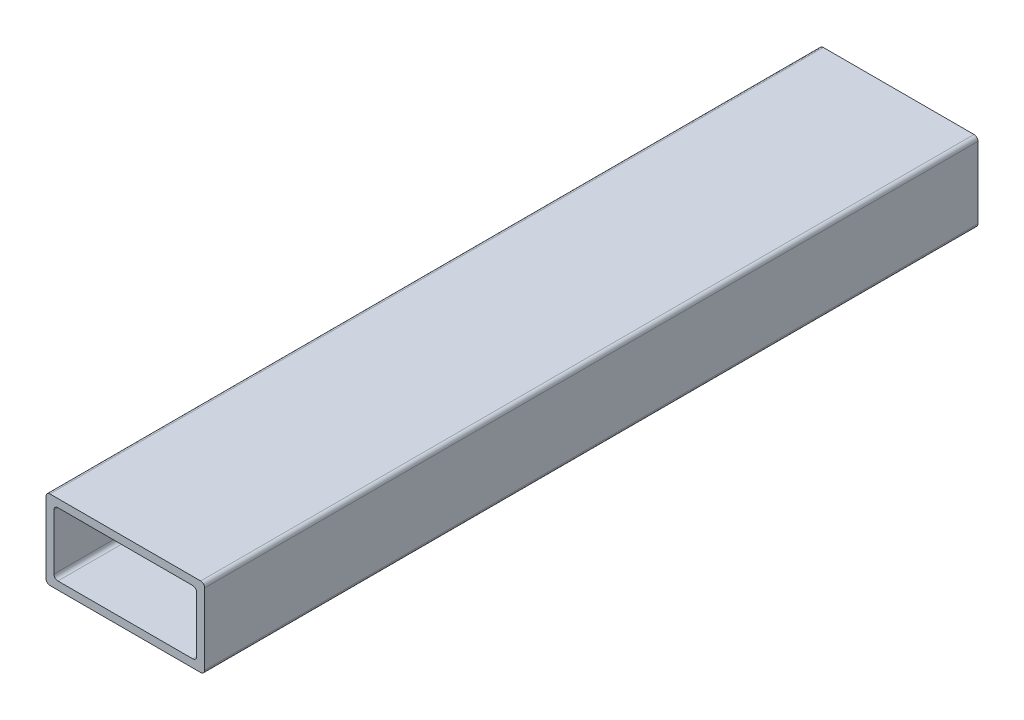
ISO-10303-21;
HEADER;
FILE_DESCRIPTION(('STEP AP214'),'2;1');
FILE_NAME('part.step','',(''),(''),'','','');
FILE_SCHEMA(('AUTOMOTIVE_DESIGN { 1 0 10303 214 1 1 1 1 }'));
ENDSEC;
DATA;
#1=APPLICATION_CONTEXT('core data for automotive mechanical design processes');
#2=APPLICATION_PROTOCOL_DEFINITION('international standard','automotive_design',2000,#1);
#3=PRODUCT_CONTEXT('',#1,'mechanical');
#4=PRODUCT('Part','Part','',(#3));
#5=PRODUCT_RELATED_PRODUCT_CATEGORY('part','',(#4));
#6=PRODUCT_DEFINITION_FORMATION('','',#4);
#7=PRODUCT_DEFINITION_CONTEXT('part definition',#1,'design');
#8=PRODUCT_DEFINITION('design','',#6,#7);
#9=PRODUCT_DEFINITION_SHAPE('','',#8);
#10=(LENGTH_UNIT() NAMED_UNIT(*) SI_UNIT(.MILLI.,.METRE.));
#11=(NAMED_UNIT(*) PLANE_ANGLE_UNIT() SI_UNIT($,.RADIAN.));
#12=(NAMED_UNIT(*) SI_UNIT($,.STERADIAN.) SOLID_ANGLE_UNIT());
#13=UNCERTAINTY_MEASURE_WITH_UNIT(LENGTH_MEASURE(1.E-05),#10,'distance_accuracy_value','');
#14=(GEOMETRIC_REPRESENTATION_CONTEXT(3) GLOBAL_UNCERTAINTY_ASSIGNED_CONTEXT((#13)) GLOBAL_UNIT_ASSIGNED_CONTEXT((#10,
#11,#12)) REPRESENTATION_CONTEXT('',''));
#15=CARTESIAN_POINT('',(0.,0.,0.));
#16=DIRECTION('',(0.,0.,1.));
#17=DIRECTION('',(1.,0.,0.));
#18=AXIS2_PLACEMENT_3D('',#15,#16,#17);
#19=CARTESIAN_POINT('',(2.,2.,390.));
#20=DIRECTION('',(0.,0.,-1.));
#21=DIRECTION('',(-1.,0.,0.));
#22=AXIS2_PLACEMENT_3D('',#19,#20,#21);
#23=PLANE('',#22);
#24=CARTESIAN_POINT('',(2.,2.,390.));
#25=DIRECTION('',(0.,0.,1.));
#26=DIRECTION('',(-1.,0.,0.));
#27=AXIS2_PLACEMENT_3D('',#24,#25,#26);
#28=CIRCLE('',#27,2.);
#29=CARTESIAN_POINT('',(0.,2.00000000000001,390.));
#30=VERTEX_POINT('',#29);
#31=CARTESIAN_POINT('',(2.00000000000001,0.,390.));
#32=VERTEX_POINT('',#31);
#33=EDGE_CURVE('E211',#30,#32,#28,.T.);
#34=ORIENTED_EDGE('',*,*,#33,.T.);
#35=DIRECTION('',(1.,0.,0.));
#36=VECTOR('',#35,1.);
#37=CARTESIAN_POINT('',(2.00000000000001,0.,390.));
#38=LINE('',#37,#36);
#39=CARTESIAN_POINT('',(78.,0.,390.));
#40=VERTEX_POINT('',#39);
#41=EDGE_CURVE('E214',#32,#40,#38,.T.);
#42=ORIENTED_EDGE('',*,*,#41,.T.);
#43=CARTESIAN_POINT('',(78.,2.,390.));
#44=DIRECTION('',(0.,0.,1.));
#45=DIRECTION('',(-1.,0.,0.));
#46=AXIS2_PLACEMENT_3D('',#43,#44,#45);
#47=CIRCLE('',#46,2.);
#48=CARTESIAN_POINT('',(80.,2.,390.));
#49=VERTEX_POINT('',#48);
#50=EDGE_CURVE('E217',#40,#49,#47,.T.);
#51=ORIENTED_EDGE('',*,*,#50,.T.);
#52=DIRECTION('',(0.,1.,0.));
#53=VECTOR('',#52,1.);
#54=CARTESIAN_POINT('',(80.,2.,390.));
#55=LINE('',#54,#53);
#56=CARTESIAN_POINT('',(80.,38.,390.));
#57=VERTEX_POINT('',#56);
#58=EDGE_CURVE('E219',#49,#57,#55,.T.);
#59=ORIENTED_EDGE('',*,*,#58,.T.);
#60=CARTESIAN_POINT('',(78.,38.,390.));
#61=DIRECTION('',(0.,0.,1.));
#62=DIRECTION('',(-1.,0.,0.));
#63=AXIS2_PLACEMENT_3D('',#60,#61,#62);
#64=CIRCLE('',#63,2.);
#65=CARTESIAN_POINT('',(78.,40.,390.));
#66=VERTEX_POINT('',#65);
#67=EDGE_CURVE('E221',#57,#66,#64,.T.);
#68=ORIENTED_EDGE('',*,*,#67,.T.);
#69=DIRECTION('',(-1.,0.,0.));
#70=VECTOR('',#69,1.);
#71=CARTESIAN_POINT('',(2.00000000000001,40.,390.));
#72=LINE('',#71,#70);
#73=CARTESIAN_POINT('',(2.00000000000001,40.,390.));
#74=VERTEX_POINT('',#73);
#75=EDGE_CURVE('E223',#66,#74,#72,.T.);
#76=ORIENTED_EDGE('',*,*,#75,.T.);
#77=CARTESIAN_POINT('',(2.,38.,390.));
#78=DIRECTION('',(0.,0.,1.));
#79=DIRECTION('',(-1.,0.,0.));
#80=AXIS2_PLACEMENT_3D('',#77,#78,#79);
#81=CIRCLE('',#80,2.);
#82=CARTESIAN_POINT('',(0.,38.,390.));
#83=VERTEX_POINT('',#82);
#84=EDGE_CURVE('E225',#74,#83,#81,.T.);
#85=ORIENTED_EDGE('',*,*,#84,.T.);
#86=DIRECTION('',(0.,-1.,0.));
#87=VECTOR('',#86,1.);
#88=CARTESIAN_POINT('',(0.,2.00000000000001,390.));
#89=LINE('',#88,#87);
#90=EDGE_CURVE('E227',#83,#30,#89,.T.);
#91=ORIENTED_EDGE('',*,*,#90,.T.);
#92=EDGE_LOOP('',(#34,#42,#51,#59,#68,#76,#85,#91));
#93=FACE_BOUND('',#92,.T.);
#94=CARTESIAN_POINT('',(74.,6.,390.));
#95=DIRECTION('',(0.,0.,1.));
#96=DIRECTION('',(1.,0.,0.));
#97=AXIS2_PLACEMENT_3D('',#94,#95,#96);
#98=CIRCLE('',#97,2.);
#99=CARTESIAN_POINT('',(74.,4.,390.));
#100=VERTEX_POINT('',#99);
#101=CARTESIAN_POINT('',(76.,6.,390.));
#102=VERTEX_POINT('',#101);
#103=EDGE_CURVE('E146',#100,#102,#98,.T.);
#104=ORIENTED_EDGE('',*,*,#103,.F.);
#105=DIRECTION('',(1.,0.,0.));
#106=VECTOR('',#105,1.);
#107=CARTESIAN_POINT('',(6.00000000000001,4.,390.));
#108=LINE('',#107,#106);
#109=CARTESIAN_POINT('',(6.00000000000001,4.,390.));
#110=VERTEX_POINT('',#109);
#111=EDGE_CURVE('E179',#110,#100,#108,.T.);
#112=ORIENTED_EDGE('',*,*,#111,.F.);
#113=CARTESIAN_POINT('',(6.,6.,390.));
#114=DIRECTION('',(0.,0.,1.));
#115=DIRECTION('',(1.,0.,0.));
#116=AXIS2_PLACEMENT_3D('',#113,#114,#115);
#117=CIRCLE('',#116,2.);
#118=CARTESIAN_POINT('',(4.,6.00000000000001,390.));
#119=VERTEX_POINT('',#118);
#120=EDGE_CURVE('E177',#119,#110,#117,.T.);
#121=ORIENTED_EDGE('',*,*,#120,.F.);
#122=DIRECTION('',(0.,-1.,0.));
#123=VECTOR('',#122,1.);
#124=CARTESIAN_POINT('',(4.,6.00000000000001,390.));
#125=LINE('',#124,#123);
#126=CARTESIAN_POINT('',(4.,34.,390.));
#127=VERTEX_POINT('',#126);
#128=EDGE_CURVE('E175',#127,#119,#125,.T.);
#129=ORIENTED_EDGE('',*,*,#128,.F.);
#130=CARTESIAN_POINT('',(6.,34.,390.));
#131=DIRECTION('',(0.,0.,1.));
#132=DIRECTION('',(1.,0.,0.));
#133=AXIS2_PLACEMENT_3D('',#130,#131,#132);
#134=CIRCLE('',#133,2.);
#135=CARTESIAN_POINT('',(6.00000000000001,36.,390.));
#136=VERTEX_POINT('',#135);
#137=EDGE_CURVE('E173',#136,#127,#134,.T.);
#138=ORIENTED_EDGE('',*,*,#137,.F.);
#139=DIRECTION('',(-1.,0.,0.));
#140=VECTOR('',#139,1.);
#141=CARTESIAN_POINT('',(6.00000000000001,36.,390.));
#142=LINE('',#141,#140);
#143=CARTESIAN_POINT('',(74.,36.,390.));
#144=VERTEX_POINT('',#143);
#145=EDGE_CURVE('E169',#144,#136,#142,.T.);
#146=ORIENTED_EDGE('',*,*,#145,.F.);
#147=CARTESIAN_POINT('',(74.,34.,390.));
#148=DIRECTION('',(0.,0.,1.));
#149=DIRECTION('',(1.,0.,0.));
#150=AXIS2_PLACEMENT_3D('',#147,#148,#149);
#151=CIRCLE('',#150,2.);
#152=CARTESIAN_POINT('',(76.,34.,390.));
#153=VERTEX_POINT('',#152);
#154=EDGE_CURVE('E167',#153,#144,#151,.T.);
#155=ORIENTED_EDGE('',*,*,#154,.F.);
#156=DIRECTION('',(0.,1.,0.));
#157=VECTOR('',#156,1.);
#158=CARTESIAN_POINT('',(76.,6.,390.));
#159=LINE('',#158,#157);
#160=EDGE_CURVE('E154',#102,#153,#159,.T.);
#161=ORIENTED_EDGE('',*,*,#160,.F.);
#162=EDGE_LOOP('',(#104,#112,#121,#129,#138,#146,#155,#161));
#163=FACE_BOUND('',#162,.T.);
#164=ADVANCED_FACE('F33',(#93,#163),#23,.F.);
#165=CARTESIAN_POINT('',(2.,2.,0.));
#166=DIRECTION('',(0.,0.,-1.));
#167=DIRECTION('',(-1.,0.,0.));
#168=AXIS2_PLACEMENT_3D('',#165,#166,#167);
#169=PLANE('',#168);
#170=CARTESIAN_POINT('',(2.,2.,0.));
#171=DIRECTION('',(0.,0.,1.));
#172=DIRECTION('',(-1.,0.,0.));
#173=AXIS2_PLACEMENT_3D('',#170,#171,#172);
#174=CIRCLE('',#173,2.);
#175=CARTESIAN_POINT('',(0.,2.00000000000001,0.));
#176=VERTEX_POINT('',#175);
#177=CARTESIAN_POINT('',(2.00000000000001,0.,0.));
#178=VERTEX_POINT('',#177);
#179=EDGE_CURVE('E162',#176,#178,#174,.T.);
#180=ORIENTED_EDGE('',*,*,#179,.F.);
#181=DIRECTION('',(0.,-1.,0.));
#182=VECTOR('',#181,1.);
#183=CARTESIAN_POINT('',(0.,2.00000000000001,0.));
#184=LINE('',#183,#182);
#185=CARTESIAN_POINT('',(0.,38.,0.));
#186=VERTEX_POINT('',#185);
#187=EDGE_CURVE('E215',#186,#176,#184,.T.);
#188=ORIENTED_EDGE('',*,*,#187,.F.);
#189=CARTESIAN_POINT('',(2.,38.,0.));
#190=DIRECTION('',(0.,0.,1.));
#191=DIRECTION('',(-1.,0.,0.));
#192=AXIS2_PLACEMENT_3D('',#189,#190,#191);
#193=CIRCLE('',#192,2.);
#194=CARTESIAN_POINT('',(2.00000000000001,40.,0.));
#195=VERTEX_POINT('',#194);
#196=EDGE_CURVE('E242',#195,#186,#193,.T.);
#197=ORIENTED_EDGE('',*,*,#196,.F.);
#198=DIRECTION('',(-1.,0.,0.));
#199=VECTOR('',#198,1.);
#200=CARTESIAN_POINT('',(2.00000000000001,40.,0.));
#201=LINE('',#200,#199);
#202=CARTESIAN_POINT('',(78.,40.,0.));
#203=VERTEX_POINT('',#202);
#204=EDGE_CURVE('E240',#203,#195,#201,.T.);
#205=ORIENTED_EDGE('',*,*,#204,.F.);
#206=CARTESIAN_POINT('',(78.,38.,0.));
#207=DIRECTION('',(0.,0.,1.));
#208=DIRECTION('',(-1.,0.,0.));
#209=AXIS2_PLACEMENT_3D('',#206,#207,#208);
#210=CIRCLE('',#209,2.);
#211=CARTESIAN_POINT('',(80.,38.,0.));
#212=VERTEX_POINT('',#211);
#213=EDGE_CURVE('E238',#212,#203,#210,.T.);
#214=ORIENTED_EDGE('',*,*,#213,.F.);
#215=DIRECTION('',(0.,1.,0.));
#216=VECTOR('',#215,1.);
#217=CARTESIAN_POINT('',(80.,2.,0.));
#218=LINE('',#217,#216);
#219=CARTESIAN_POINT('',(80.,2.,0.));
#220=VERTEX_POINT('',#219);
#221=EDGE_CURVE('E236',#220,#212,#218,.T.);
#222=ORIENTED_EDGE('',*,*,#221,.F.);
#223=CARTESIAN_POINT('',(78.,2.,0.));
#224=DIRECTION('',(0.,0.,1.));
#225=DIRECTION('',(-1.,0.,0.));
#226=AXIS2_PLACEMENT_3D('',#223,#224,#225);
#227=CIRCLE('',#226,2.);
#228=CARTESIAN_POINT('',(78.,0.,0.));
#229=VERTEX_POINT('',#228);
#230=EDGE_CURVE('E234',#229,#220,#227,.T.);
#231=ORIENTED_EDGE('',*,*,#230,.F.);
#232=DIRECTION('',(1.,0.,0.));
#233=VECTOR('',#232,1.);
#234=CARTESIAN_POINT('',(2.00000000000001,0.,0.));
#235=LINE('',#234,#233);
#236=EDGE_CURVE('E232',#178,#229,#235,.T.);
#237=ORIENTED_EDGE('',*,*,#236,.F.);
#238=EDGE_LOOP('',(#180,#188,#197,#205,#214,#222,#231,#237));
#239=FACE_BOUND('',#238,.T.);
#240=DIRECTION('',(1.,0.,0.));
#241=VECTOR('',#240,1.);
#242=CARTESIAN_POINT('',(6.00000000000001,4.,0.));
#243=LINE('',#242,#241);
#244=CARTESIAN_POINT('',(6.00000000000001,4.,0.));
#245=VERTEX_POINT('',#244);
#246=CARTESIAN_POINT('',(74.,4.,0.));
#247=VERTEX_POINT('',#246);
#248=EDGE_CURVE('E155',#245,#247,#243,.T.);
#249=ORIENTED_EDGE('',*,*,#248,.T.);
#250=CARTESIAN_POINT('',(74.,6.,0.));
#251=DIRECTION('',(0.,0.,1.));
#252=DIRECTION('',(1.,0.,0.));
#253=AXIS2_PLACEMENT_3D('',#250,#251,#252);
#254=CIRCLE('',#253,2.);
#255=CARTESIAN_POINT('',(76.,6.,0.));
#256=VERTEX_POINT('',#255);
#257=EDGE_CURVE('E56',#247,#256,#254,.T.);
#258=ORIENTED_EDGE('',*,*,#257,.T.);
#259=DIRECTION('',(0.,1.,0.));
#260=VECTOR('',#259,1.);
#261=CARTESIAN_POINT('',(76.,6.,0.));
#262=LINE('',#261,#260);
#263=CARTESIAN_POINT('',(76.,34.,0.));
#264=VERTEX_POINT('',#263);
#265=EDGE_CURVE('E161',#256,#264,#262,.T.);
#266=ORIENTED_EDGE('',*,*,#265,.T.);
#267=CARTESIAN_POINT('',(74.,34.,0.));
#268=DIRECTION('',(0.,0.,1.));
#269=DIRECTION('',(1.,0.,0.));
#270=AXIS2_PLACEMENT_3D('',#267,#268,#269);
#271=CIRCLE('',#270,2.);
#272=CARTESIAN_POINT('',(74.,36.,0.));
#273=VERTEX_POINT('',#272);
#274=EDGE_CURVE('E183',#264,#273,#271,.T.);
#275=ORIENTED_EDGE('',*,*,#274,.T.);
#276=DIRECTION('',(-1.,0.,0.));
#277=VECTOR('',#276,1.);
#278=CARTESIAN_POINT('',(6.00000000000001,36.,0.));
#279=LINE('',#278,#277);
#280=CARTESIAN_POINT('',(6.00000000000001,36.,0.));
#281=VERTEX_POINT('',#280);
#282=EDGE_CURVE('E186',#273,#281,#279,.T.);
#283=ORIENTED_EDGE('',*,*,#282,.T.);
#284=CARTESIAN_POINT('',(6.,34.,0.));
#285=DIRECTION('',(0.,0.,1.));
#286=DIRECTION('',(1.,0.,0.));
#287=AXIS2_PLACEMENT_3D('',#284,#285,#286);
#288=CIRCLE('',#287,2.);
#289=CARTESIAN_POINT('',(4.,34.,0.));
#290=VERTEX_POINT('',#289);
#291=EDGE_CURVE('E189',#281,#290,#288,.T.);
#292=ORIENTED_EDGE('',*,*,#291,.T.);
#293=DIRECTION('',(0.,-1.,0.));
#294=VECTOR('',#293,1.);
#295=CARTESIAN_POINT('',(4.,6.00000000000001,0.));
#296=LINE('',#295,#294);
#297=CARTESIAN_POINT('',(4.,6.00000000000001,0.));
#298=VERTEX_POINT('',#297);
#299=EDGE_CURVE('E192',#290,#298,#296,.T.);
#300=ORIENTED_EDGE('',*,*,#299,.T.);
#301=CARTESIAN_POINT('',(6.,6.,0.));
#302=DIRECTION('',(0.,0.,1.));
#303=DIRECTION('',(1.,0.,0.));
#304=AXIS2_PLACEMENT_3D('',#301,#302,#303);
#305=CIRCLE('',#304,2.);
#306=EDGE_CURVE('E195',#298,#245,#305,.T.);
#307=ORIENTED_EDGE('',*,*,#306,.T.);
#308=EDGE_LOOP('',(#249,#258,#266,#275,#283,#292,#300,#307));
#309=FACE_BOUND('',#308,.T.);
#310=ADVANCED_FACE('F272',(#239,#309),#169,.T.);
#311=CARTESIAN_POINT('',(2.,2.,390.));
#312=DIRECTION('',(0.,0.,-1.));
#313=DIRECTION('',(-1.,0.,0.));
#314=AXIS2_PLACEMENT_3D('',#311,#312,#313);
#315=CYLINDRICAL_SURFACE('',#314,2.);
#316=ORIENTED_EDGE('',*,*,#179,.T.);
#317=DIRECTION('',(0.,0.,-1.));
#318=VECTOR('',#317,1.);
#319=CARTESIAN_POINT('',(2.00000000000001,0.,390.));
#320=LINE('',#319,#318);
#321=EDGE_CURVE('E11',#32,#178,#320,.T.);
#322=ORIENTED_EDGE('',*,*,#321,.F.);
#323=ORIENTED_EDGE('',*,*,#33,.F.);
#324=DIRECTION('',(0.,0.,-1.));
#325=VECTOR('',#324,1.);
#326=CARTESIAN_POINT('',(0.,2.00000000000001,390.));
#327=LINE('',#326,#325);
#328=EDGE_CURVE('E229',#30,#176,#327,.T.);
#329=ORIENTED_EDGE('',*,*,#328,.T.);
#330=EDGE_LOOP('',(#316,#322,#323,#329));
#331=FACE_BOUND('',#330,.T.);
#332=ADVANCED_FACE('F35',(#331),#315,.T.);
#333=CARTESIAN_POINT('',(2.00000000000001,0.,390.));
#334=DIRECTION('',(0.,1.,0.));
#335=DIRECTION('',(0.,0.,1.));
#336=AXIS2_PLACEMENT_3D('',#333,#334,#335);
#337=PLANE('',#336);
#338=ORIENTED_EDGE('',*,*,#236,.T.);
#339=DIRECTION('',(0.,0.,-1.));
#340=VECTOR('',#339,1.);
#341=CARTESIAN_POINT('',(78.,0.,390.));
#342=LINE('',#341,#340);
#343=EDGE_CURVE('E41',#40,#229,#342,.T.);
#344=ORIENTED_EDGE('',*,*,#343,.F.);
#345=ORIENTED_EDGE('',*,*,#41,.F.);
#346=ORIENTED_EDGE('',*,*,#321,.T.);
#347=EDGE_LOOP('',(#338,#344,#345,#346));
#348=FACE_BOUND('',#347,.T.);
#349=ADVANCED_FACE('F289',(#348),#337,.F.);
#350=CARTESIAN_POINT('',(78.,2.,390.));
#351=DIRECTION('',(0.,0.,-1.));
#352=DIRECTION('',(-1.,0.,0.));
#353=AXIS2_PLACEMENT_3D('',#350,#351,#352);
#354=CYLINDRICAL_SURFACE('',#353,2.);
#355=ORIENTED_EDGE('',*,*,#230,.T.);
#356=DIRECTION('',(0.,0.,-1.));
#357=VECTOR('',#356,1.);
#358=CARTESIAN_POINT('',(80.,2.,390.));
#359=LINE('',#358,#357);
#360=EDGE_CURVE('E259',#49,#220,#359,.T.);
#361=ORIENTED_EDGE('',*,*,#360,.F.);
#362=ORIENTED_EDGE('',*,*,#50,.F.);
#363=ORIENTED_EDGE('',*,*,#343,.T.);
#364=EDGE_LOOP('',(#355,#361,#362,#363));
#365=FACE_BOUND('',#364,.T.);
#366=ADVANCED_FACE('F266',(#365),#354,.T.);
#367=CARTESIAN_POINT('',(80.,2.,390.));
#368=DIRECTION('',(-1.,0.,0.));
#369=DIRECTION('',(0.,0.,1.));
#370=AXIS2_PLACEMENT_3D('',#367,#368,#369);
#371=PLANE('',#370);
#372=ORIENTED_EDGE('',*,*,#221,.T.);
#373=DIRECTION('',(0.,0.,-1.));
#374=VECTOR('',#373,1.);
#375=CARTESIAN_POINT('',(80.,38.,390.));
#376=LINE('',#375,#374);
#377=EDGE_CURVE('E256',#57,#212,#376,.T.);
#378=ORIENTED_EDGE('',*,*,#377,.F.);
#379=ORIENTED_EDGE('',*,*,#58,.F.);
#380=ORIENTED_EDGE('',*,*,#360,.T.);
#381=EDGE_LOOP('',(#372,#378,#379,#380));
#382=FACE_BOUND('',#381,.T.);
#383=ADVANCED_FACE('F278',(#382),#371,.F.);
#384=CARTESIAN_POINT('',(78.,38.,390.));
#385=DIRECTION('',(0.,0.,-1.));
#386=DIRECTION('',(-1.,0.,0.));
#387=AXIS2_PLACEMENT_3D('',#384,#385,#386);
#388=CYLINDRICAL_SURFACE('',#387,2.);
#389=ORIENTED_EDGE('',*,*,#213,.T.);
#390=DIRECTION('',(0.,0.,-1.));
#391=VECTOR('',#390,1.);
#392=CARTESIAN_POINT('',(78.,40.,390.));
#393=LINE('',#392,#391);
#394=EDGE_CURVE('E253',#66,#203,#393,.T.);
#395=ORIENTED_EDGE('',*,*,#394,.F.);
#396=ORIENTED_EDGE('',*,*,#67,.F.);
#397=ORIENTED_EDGE('',*,*,#377,.T.);
#398=EDGE_LOOP('',(#389,#395,#396,#397));
#399=FACE_BOUND('',#398,.T.);
#400=ADVANCED_FACE('F282',(#399),#388,.T.);
#401=CARTESIAN_POINT('',(2.00000000000001,40.,390.));
#402=DIRECTION('',(0.,-1.,0.));
#403=DIRECTION('',(0.,0.,-1.));
#404=AXIS2_PLACEMENT_3D('',#401,#402,#403);
#405=PLANE('',#404);
#406=ORIENTED_EDGE('',*,*,#204,.T.);
#407=DIRECTION('',(0.,0.,-1.));
#408=VECTOR('',#407,1.);
#409=CARTESIAN_POINT('',(2.00000000000001,40.,390.));
#410=LINE('',#409,#408);
#411=EDGE_CURVE('E250',#74,#195,#410,.T.);
#412=ORIENTED_EDGE('',*,*,#411,.F.);
#413=ORIENTED_EDGE('',*,*,#75,.F.);
#414=ORIENTED_EDGE('',*,*,#394,.T.);
#415=EDGE_LOOP('',(#406,#412,#413,#414));
#416=FACE_BOUND('',#415,.T.);
#417=ADVANCED_FACE('F302',(#416),#405,.F.);
#418=CARTESIAN_POINT('',(2.,38.,390.));
#419=DIRECTION('',(0.,0.,-1.));
#420=DIRECTION('',(-1.,0.,0.));
#421=AXIS2_PLACEMENT_3D('',#418,#419,#420);
#422=CYLINDRICAL_SURFACE('',#421,2.);
#423=ORIENTED_EDGE('',*,*,#196,.T.);
#424=DIRECTION('',(0.,0.,-1.));
#425=VECTOR('',#424,1.);
#426=CARTESIAN_POINT('',(0.,38.,390.));
#427=LINE('',#426,#425);
#428=EDGE_CURVE('E247',#83,#186,#427,.T.);
#429=ORIENTED_EDGE('',*,*,#428,.F.);
#430=ORIENTED_EDGE('',*,*,#84,.F.);
#431=ORIENTED_EDGE('',*,*,#411,.T.);
#432=EDGE_LOOP('',(#423,#429,#430,#431));
#433=FACE_BOUND('',#432,.T.);
#434=ADVANCED_FACE('F300',(#433),#422,.T.);
#435=CARTESIAN_POINT('',(0.,2.00000000000001,390.));
#436=DIRECTION('',(1.,0.,0.));
#437=DIRECTION('',(0.,0.,-1.));
#438=AXIS2_PLACEMENT_3D('',#435,#436,#437);
#439=PLANE('',#438);
#440=ORIENTED_EDGE('',*,*,#187,.T.);
#441=ORIENTED_EDGE('',*,*,#328,.F.);
#442=ORIENTED_EDGE('',*,*,#90,.F.);
#443=ORIENTED_EDGE('',*,*,#428,.T.);
#444=EDGE_LOOP('',(#440,#441,#442,#443));
#445=FACE_BOUND('',#444,.T.);
#446=ADVANCED_FACE('F295',(#445),#439,.F.);
#447=CARTESIAN_POINT('',(74.,6.,390.));
#448=DIRECTION('',(0.,0.,-1.));
#449=DIRECTION('',(-1.,0.,0.));
#450=AXIS2_PLACEMENT_3D('',#447,#448,#449);
#451=CYLINDRICAL_SURFACE('',#450,2.);
#452=ORIENTED_EDGE('',*,*,#257,.F.);
#453=DIRECTION('',(0.,0.,-1.));
#454=VECTOR('',#453,1.);
#455=CARTESIAN_POINT('',(74.,4.,390.));
#456=LINE('',#455,#454);
#457=EDGE_CURVE('E150',#100,#247,#456,.T.);
#458=ORIENTED_EDGE('',*,*,#457,.F.);
#459=ORIENTED_EDGE('',*,*,#103,.T.);
#460=DIRECTION('',(0.,0.,-1.));
#461=VECTOR('',#460,1.);
#462=CARTESIAN_POINT('',(76.,6.,390.));
#463=LINE('',#462,#461);
#464=EDGE_CURVE('E149',#102,#256,#463,.T.);
#465=ORIENTED_EDGE('',*,*,#464,.T.);
#466=EDGE_LOOP('',(#452,#458,#459,#465));
#467=FACE_BOUND('',#466,.T.);
#468=ADVANCED_FACE('F148',(#467),#451,.F.);
#469=CARTESIAN_POINT('',(76.,6.,390.));
#470=DIRECTION('',(-1.,0.,0.));
#471=DIRECTION('',(0.,0.,1.));
#472=AXIS2_PLACEMENT_3D('',#469,#470,#471);
#473=PLANE('',#472);
#474=ORIENTED_EDGE('',*,*,#265,.F.);
#475=ORIENTED_EDGE('',*,*,#464,.F.);
#476=ORIENTED_EDGE('',*,*,#160,.T.);
#477=DIRECTION('',(0.,0.,-1.));
#478=VECTOR('',#477,1.);
#479=CARTESIAN_POINT('',(76.,34.,390.));
#480=LINE('',#479,#478);
#481=EDGE_CURVE('E163',#153,#264,#480,.T.);
#482=ORIENTED_EDGE('',*,*,#481,.T.);
#483=EDGE_LOOP('',(#474,#475,#476,#482));
#484=FACE_BOUND('',#483,.T.);
#485=ADVANCED_FACE('F158',(#484),#473,.T.);
#486=CARTESIAN_POINT('',(74.,34.,390.));
#487=DIRECTION('',(0.,0.,-1.));
#488=DIRECTION('',(-1.,0.,0.));
#489=AXIS2_PLACEMENT_3D('',#486,#487,#488);
#490=CYLINDRICAL_SURFACE('',#489,2.);
#491=ORIENTED_EDGE('',*,*,#274,.F.);
#492=ORIENTED_EDGE('',*,*,#481,.F.);
#493=ORIENTED_EDGE('',*,*,#154,.T.);
#494=DIRECTION('',(0.,0.,-1.));
#495=VECTOR('',#494,1.);
#496=CARTESIAN_POINT('',(74.,36.,390.));
#497=LINE('',#496,#495);
#498=EDGE_CURVE('E208',#144,#273,#497,.T.);
#499=ORIENTED_EDGE('',*,*,#498,.T.);
#500=EDGE_LOOP('',(#491,#492,#493,#499));
#501=FACE_BOUND('',#500,.T.);
#502=ADVANCED_FACE('F327',(#501),#490,.F.);
#503=CARTESIAN_POINT('',(6.00000000000001,36.,390.));
#504=DIRECTION('',(0.,-1.,0.));
#505=DIRECTION('',(0.,0.,-1.));
#506=AXIS2_PLACEMENT_3D('',#503,#504,#505);
#507=PLANE('',#506);
#508=ORIENTED_EDGE('',*,*,#282,.F.);
#509=ORIENTED_EDGE('',*,*,#498,.F.);
#510=ORIENTED_EDGE('',*,*,#145,.T.);
#511=DIRECTION('',(0.,0.,-1.));
#512=VECTOR('',#511,1.);
#513=CARTESIAN_POINT('',(6.00000000000001,36.,390.));
#514=LINE('',#513,#512);
#515=EDGE_CURVE('E206',#136,#281,#514,.T.);
#516=ORIENTED_EDGE('',*,*,#515,.T.);
#517=EDGE_LOOP('',(#508,#509,#510,#516));
#518=FACE_BOUND('',#517,.T.);
#519=ADVANCED_FACE('F331',(#518),#507,.T.);
#520=CARTESIAN_POINT('',(6.,34.,390.));
#521=DIRECTION('',(0.,0.,-1.));
#522=DIRECTION('',(-1.,0.,0.));
#523=AXIS2_PLACEMENT_3D('',#520,#521,#522);
#524=CYLINDRICAL_SURFACE('',#523,2.);
#525=ORIENTED_EDGE('',*,*,#291,.F.);
#526=ORIENTED_EDGE('',*,*,#515,.F.);
#527=ORIENTED_EDGE('',*,*,#137,.T.);
#528=DIRECTION('',(0.,0.,-1.));
#529=VECTOR('',#528,1.);
#530=CARTESIAN_POINT('',(4.,34.,390.));
#531=LINE('',#530,#529);
#532=EDGE_CURVE('E204',#127,#290,#531,.T.);
#533=ORIENTED_EDGE('',*,*,#532,.T.);
#534=EDGE_LOOP('',(#525,#526,#527,#533));
#535=FACE_BOUND('',#534,.T.);
#536=ADVANCED_FACE('F337',(#535),#524,.F.);
#537=CARTESIAN_POINT('',(4.,6.00000000000001,390.));
#538=DIRECTION('',(1.,0.,0.));
#539=DIRECTION('',(0.,0.,-1.));
#540=AXIS2_PLACEMENT_3D('',#537,#538,#539);
#541=PLANE('',#540);
#542=ORIENTED_EDGE('',*,*,#299,.F.);
#543=ORIENTED_EDGE('',*,*,#532,.F.);
#544=ORIENTED_EDGE('',*,*,#128,.T.);
#545=DIRECTION('',(0.,0.,-1.));
#546=VECTOR('',#545,1.);
#547=CARTESIAN_POINT('',(4.,6.00000000000001,390.));
#548=LINE('',#547,#546);
#549=EDGE_CURVE('E202',#119,#298,#548,.T.);
#550=ORIENTED_EDGE('',*,*,#549,.T.);
#551=EDGE_LOOP('',(#542,#543,#544,#550));
#552=FACE_BOUND('',#551,.T.);
#553=ADVANCED_FACE('F341',(#552),#541,.T.);
#554=CARTESIAN_POINT('',(6.,6.,390.));
#555=DIRECTION('',(0.,0.,-1.));
#556=DIRECTION('',(-1.,0.,0.));
#557=AXIS2_PLACEMENT_3D('',#554,#555,#556);
#558=CYLINDRICAL_SURFACE('',#557,2.);
#559=ORIENTED_EDGE('',*,*,#306,.F.);
#560=ORIENTED_EDGE('',*,*,#549,.F.);
#561=ORIENTED_EDGE('',*,*,#120,.T.);
#562=DIRECTION('',(0.,0.,-1.));
#563=VECTOR('',#562,1.);
#564=CARTESIAN_POINT('',(6.00000000000001,4.,390.));
#565=LINE('',#564,#563);
#566=EDGE_CURVE('E48',#110,#245,#565,.T.);
#567=ORIENTED_EDGE('',*,*,#566,.T.);
#568=EDGE_LOOP('',(#559,#560,#561,#567));
#569=FACE_BOUND('',#568,.T.);
#570=ADVANCED_FACE('F345',(#569),#558,.F.);
#571=CARTESIAN_POINT('',(6.00000000000001,4.,390.));
#572=DIRECTION('',(0.,1.,0.));
#573=DIRECTION('',(0.,0.,1.));
#574=AXIS2_PLACEMENT_3D('',#571,#572,#573);
#575=PLANE('',#574);
#576=ORIENTED_EDGE('',*,*,#248,.F.);
#577=ORIENTED_EDGE('',*,*,#566,.F.);
#578=ORIENTED_EDGE('',*,*,#111,.T.);
#579=ORIENTED_EDGE('',*,*,#457,.T.);
#580=EDGE_LOOP('',(#576,#577,#578,#579));
#581=FACE_BOUND('',#580,.T.);
#582=ADVANCED_FACE('F349',(#581),#575,.T.);
#583=CLOSED_SHELL('',(#164,#310,#332,#349,#366,#383,#400,#417,#434,#446,#468,#485,#502,#519,
#536,#553,#570,#582));
#584=MANIFOLD_SOLID_BREP('B2',#583);
#585=ADVANCED_BREP_SHAPE_REPRESENTATION('',(#18,#584),#14);
#586=SHAPE_DEFINITION_REPRESENTATION(#9,#585);
ENDSEC;
END-ISO-10303-21;
